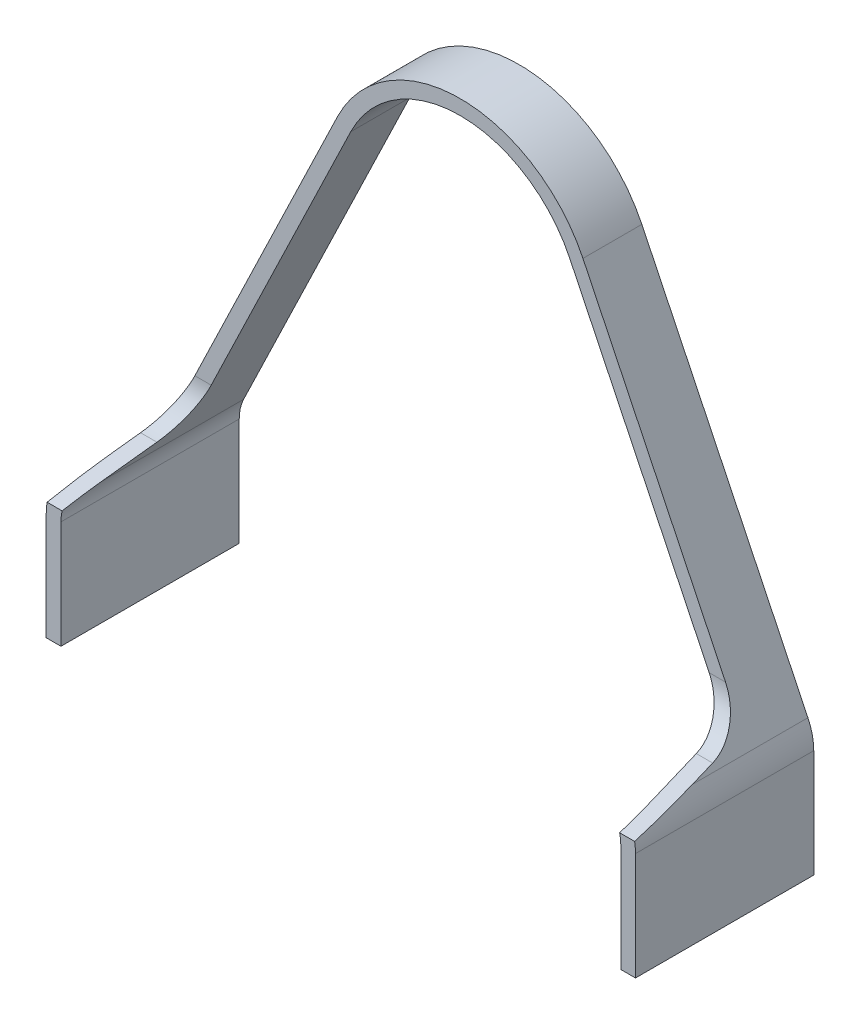
ISO-10303-21;
HEADER;
FILE_DESCRIPTION(('STEP AP214'),'2;1');
FILE_NAME('part.step','',(''),(''),'','','');
FILE_SCHEMA(('AUTOMOTIVE_DESIGN { 1 0 10303 214 1 1 1 1 }'));
ENDSEC;
DATA;
#1=APPLICATION_CONTEXT('core data for automotive mechanical design processes');
#2=APPLICATION_PROTOCOL_DEFINITION('international standard','automotive_design',2000,#1);
#3=PRODUCT_CONTEXT('',#1,'mechanical');
#4=PRODUCT('Part','Part','',(#3));
#5=PRODUCT_RELATED_PRODUCT_CATEGORY('part','',(#4));
#6=PRODUCT_DEFINITION_FORMATION('','',#4);
#7=PRODUCT_DEFINITION_CONTEXT('part definition',#1,'design');
#8=PRODUCT_DEFINITION('design','',#6,#7);
#9=PRODUCT_DEFINITION_SHAPE('','',#8);
#10=(LENGTH_UNIT() NAMED_UNIT(*) SI_UNIT(.MILLI.,.METRE.));
#11=(NAMED_UNIT(*) PLANE_ANGLE_UNIT() SI_UNIT($,.RADIAN.));
#12=(NAMED_UNIT(*) SI_UNIT($,.STERADIAN.) SOLID_ANGLE_UNIT());
#13=UNCERTAINTY_MEASURE_WITH_UNIT(LENGTH_MEASURE(1.E-05),#10,'distance_accuracy_value','');
#14=(GEOMETRIC_REPRESENTATION_CONTEXT(3) GLOBAL_UNCERTAINTY_ASSIGNED_CONTEXT((#13)) GLOBAL_UNIT_ASSIGNED_CONTEXT((#10,
#11,#12)) REPRESENTATION_CONTEXT('',''));
#15=CARTESIAN_POINT('',(0.,0.,0.));
#16=DIRECTION('',(0.,0.,1.));
#17=DIRECTION('',(1.,0.,0.));
#18=AXIS2_PLACEMENT_3D('',#15,#16,#17);
#19=CARTESIAN_POINT('',(160.,-210.857487735556,121.));
#20=DIRECTION('',(0.,0.,1.));
#21=DIRECTION('',(1.,0.,0.));
#22=AXIS2_PLACEMENT_3D('',#19,#20,#21);
#23=PLANE('',#22);
#24=DIRECTION('',(1.,0.,0.));
#25=VECTOR('',#24,1.);
#26=CARTESIAN_POINT('',(160.,-204.,121.));
#27=LINE('',#26,#25);
#28=CARTESIAN_POINT('',(-199.407802044223,-204.,121.));
#29=VERTEX_POINT('',#28);
#30=CARTESIAN_POINT('',(-189.205733374745,-204.,121.));
#31=VERTEX_POINT('',#30);
#32=EDGE_CURVE('E242',#29,#31,#27,.T.);
#33=ORIENTED_EDGE('',*,*,#32,.F.);
#34=CARTESIAN_POINT('',(-160.,-210.857487735556,121.));
#35=DIRECTION('',(0.,0.,1.));
#36=DIRECTION('',(-1.,0.,0.));
#37=AXIS2_PLACEMENT_3D('',#34,#35,#36);
#38=CIRCLE('',#37,40.);
#39=CARTESIAN_POINT('',(-200.,-210.857487735556,121.));
#40=VERTEX_POINT('',#39);
#41=EDGE_CURVE('E147',#29,#40,#38,.T.);
#42=ORIENTED_EDGE('',*,*,#41,.T.);
#43=DIRECTION('',(0.,-1.,0.));
#44=VECTOR('',#43,1.);
#45=CARTESIAN_POINT('',(-200.,-284.,121.));
#46=LINE('',#45,#44);
#47=CARTESIAN_POINT('',(-200.,-284.,121.));
#48=VERTEX_POINT('',#47);
#49=EDGE_CURVE('E140',#40,#48,#46,.T.);
#50=ORIENTED_EDGE('',*,*,#49,.T.);
#51=DIRECTION('',(1.,0.,0.));
#52=VECTOR('',#51,1.);
#53=CARTESIAN_POINT('',(-190.,-284.,121.));
#54=LINE('',#53,#52);
#55=CARTESIAN_POINT('',(-190.,-284.,121.));
#56=VERTEX_POINT('',#55);
#57=EDGE_CURVE('E144',#48,#56,#54,.T.);
#58=ORIENTED_EDGE('',*,*,#57,.T.);
#59=DIRECTION('',(0.,1.,0.));
#60=VECTOR('',#59,1.);
#61=CARTESIAN_POINT('',(-190.,-210.857487735556,121.));
#62=LINE('',#61,#60);
#63=CARTESIAN_POINT('',(-190.,-210.857487735556,121.));
#64=VERTEX_POINT('',#63);
#65=EDGE_CURVE('E59',#56,#64,#62,.T.);
#66=ORIENTED_EDGE('',*,*,#65,.T.);
#67=CARTESIAN_POINT('',(-160.,-210.857487735556,121.));
#68=DIRECTION('',(0.,0.,-1.));
#69=DIRECTION('',(-1.,0.,0.));
#70=AXIS2_PLACEMENT_3D('',#67,#68,#69);
#71=CIRCLE('',#70,30.);
#72=EDGE_CURVE('E165',#64,#31,#71,.T.);
#73=ORIENTED_EDGE('',*,*,#72,.T.);
#74=EDGE_LOOP('',(#33,#42,#50,#58,#66,#73));
#75=FACE_BOUND('',#74,.T.);
#76=ADVANCED_FACE('F35',(#75),#23,.T.);
#77=CARTESIAN_POINT('',(160.,-210.857487735556,121.));
#78=DIRECTION('',(0.,0.,-1.));
#79=DIRECTION('',(-1.,0.,0.));
#80=AXIS2_PLACEMENT_3D('',#77,#78,#79);
#81=CYLINDRICAL_SURFACE('',#80,30.);
#82=CARTESIAN_POINT('',(160.,-210.857487735556,121.));
#83=DIRECTION('',(0.,0.,-1.));
#84=DIRECTION('',(1.,0.,0.));
#85=AXIS2_PLACEMENT_3D('',#82,#83,#84);
#86=CIRCLE('',#85,30.);
#87=CARTESIAN_POINT('',(189.205733374745,-204.,121.));
#88=VERTEX_POINT('',#87);
#89=CARTESIAN_POINT('',(190.,-210.857487735556,121.));
#90=VERTEX_POINT('',#89);
#91=EDGE_CURVE('E124',#88,#90,#86,.T.);
#92=ORIENTED_EDGE('',*,*,#91,.F.);
#93=CARTESIAN_POINT('',(160.,-210.857487735556,148.772825329001));
#94=DIRECTION('',(0.,-0.970843443512661,-0.239714430496953));
#95=DIRECTION('',(0.,0.239714430496953,-0.970843443512661));
#96=AXIS2_PLACEMENT_3D('',#93,#94,#95);
#97=ELLIPSE('',#96,125.148911301697,30.);
#98=CARTESIAN_POINT('',(187.020661681244,-197.823538130476,95.9853294284267));
#99=VERTEX_POINT('',#98);
#100=EDGE_CURVE('E50',#88,#99,#97,.F.);
#101=ORIENTED_EDGE('',*,*,#100,.T.);
#102=DIRECTION('',(0.,0.,-1.));
#103=VECTOR('',#102,1.);
#104=CARTESIAN_POINT('',(187.020661681244,-197.823538130476,121.));
#105=LINE('',#104,#103);
#106=CARTESIAN_POINT('',(187.020661681244,-197.823538130476,0.));
#107=VERTEX_POINT('',#106);
#108=EDGE_CURVE('E116',#99,#107,#105,.T.);
#109=ORIENTED_EDGE('',*,*,#108,.T.);
#110=CARTESIAN_POINT('',(160.,-210.857487735556,0.));
#111=DIRECTION('',(0.,0.,-1.));
#112=DIRECTION('',(1.,0.,0.));
#113=AXIS2_PLACEMENT_3D('',#110,#111,#112);
#114=CIRCLE('',#113,30.);
#115=CARTESIAN_POINT('',(190.,-210.857487735556,0.));
#116=VERTEX_POINT('',#115);
#117=EDGE_CURVE('E170',#107,#116,#114,.T.);
#118=ORIENTED_EDGE('',*,*,#117,.T.);
#119=DIRECTION('',(0.,0.,-1.));
#120=VECTOR('',#119,1.);
#121=CARTESIAN_POINT('',(190.,-210.857487735556,121.));
#122=LINE('',#121,#120);
#123=EDGE_CURVE('E238',#90,#116,#122,.T.);
#124=ORIENTED_EDGE('',*,*,#123,.F.);
#125=EDGE_LOOP('',(#92,#101,#109,#118,#124));
#126=FACE_BOUND('',#125,.T.);
#127=ADVANCED_FACE('F37',(#126),#81,.F.);
#128=CARTESIAN_POINT('',(190.,-210.857487735556,121.));
#129=DIRECTION('',(1.,0.,0.));
#130=DIRECTION('',(0.,0.,-1.));
#131=AXIS2_PLACEMENT_3D('',#128,#129,#130);
#132=PLANE('',#131);
#133=DIRECTION('',(0.,-1.,0.));
#134=VECTOR('',#133,1.);
#135=CARTESIAN_POINT('',(190.,-210.857487735556,0.));
#136=LINE('',#135,#134);
#137=CARTESIAN_POINT('',(190.,-284.,0.));
#138=VERTEX_POINT('',#137);
#139=EDGE_CURVE('E172',#116,#138,#136,.T.);
#140=ORIENTED_EDGE('',*,*,#139,.T.);
#141=DIRECTION('',(0.,0.,-1.));
#142=VECTOR('',#141,1.);
#143=CARTESIAN_POINT('',(190.,-284.,121.));
#144=LINE('',#143,#142);
#145=CARTESIAN_POINT('',(190.,-284.,121.));
#146=VERTEX_POINT('',#145);
#147=EDGE_CURVE('E235',#146,#138,#144,.T.);
#148=ORIENTED_EDGE('',*,*,#147,.F.);
#149=DIRECTION('',(0.,-1.,0.));
#150=VECTOR('',#149,1.);
#151=CARTESIAN_POINT('',(190.,-210.857487735556,121.));
#152=LINE('',#151,#150);
#153=EDGE_CURVE('E308',#90,#146,#152,.T.);
#154=ORIENTED_EDGE('',*,*,#153,.F.);
#155=ORIENTED_EDGE('',*,*,#123,.T.);
#156=EDGE_LOOP('',(#140,#148,#154,#155));
#157=FACE_BOUND('',#156,.T.);
#158=ADVANCED_FACE('F376',(#157),#132,.F.);
#159=CARTESIAN_POINT('',(190.,-284.,121.));
#160=DIRECTION('',(0.,1.,0.));
#161=DIRECTION('',(-1.,0.,0.));
#162=AXIS2_PLACEMENT_3D('',#159,#160,#161);
#163=PLANE('',#162);
#164=DIRECTION('',(1.,0.,0.));
#165=VECTOR('',#164,1.);
#166=CARTESIAN_POINT('',(190.,-284.,0.));
#167=LINE('',#166,#165);
#168=CARTESIAN_POINT('',(200.,-284.,0.));
#169=VERTEX_POINT('',#168);
#170=EDGE_CURVE('E175',#138,#169,#167,.T.);
#171=ORIENTED_EDGE('',*,*,#170,.T.);
#172=DIRECTION('',(0.,0.,-1.));
#173=VECTOR('',#172,1.);
#174=CARTESIAN_POINT('',(200.,-284.,121.));
#175=LINE('',#174,#173);
#176=CARTESIAN_POINT('',(200.,-284.,121.));
#177=VERTEX_POINT('',#176);
#178=EDGE_CURVE('E232',#177,#169,#175,.T.);
#179=ORIENTED_EDGE('',*,*,#178,.F.);
#180=DIRECTION('',(1.,0.,0.));
#181=VECTOR('',#180,1.);
#182=CARTESIAN_POINT('',(190.,-284.,121.));
#183=LINE('',#182,#181);
#184=EDGE_CURVE('E310',#146,#177,#183,.T.);
#185=ORIENTED_EDGE('',*,*,#184,.F.);
#186=ORIENTED_EDGE('',*,*,#147,.T.);
#187=EDGE_LOOP('',(#171,#179,#185,#186));
#188=FACE_BOUND('',#187,.T.);
#189=ADVANCED_FACE('F381',(#188),#163,.F.);
#190=CARTESIAN_POINT('',(200.,-284.,121.));
#191=DIRECTION('',(-1.,0.,0.));
#192=DIRECTION('',(0.,0.,1.));
#193=AXIS2_PLACEMENT_3D('',#190,#191,#192);
#194=PLANE('',#193);
#195=DIRECTION('',(0.,1.,0.));
#196=VECTOR('',#195,1.);
#197=CARTESIAN_POINT('',(200.,-284.,0.));
#198=LINE('',#197,#196);
#199=CARTESIAN_POINT('',(200.,-210.857487735556,0.));
#200=VERTEX_POINT('',#199);
#201=EDGE_CURVE('E177',#169,#200,#198,.T.);
#202=ORIENTED_EDGE('',*,*,#201,.T.);
#203=DIRECTION('',(0.,0.,-1.));
#204=VECTOR('',#203,1.);
#205=CARTESIAN_POINT('',(200.,-210.857487735556,121.));
#206=LINE('',#205,#204);
#207=CARTESIAN_POINT('',(200.,-210.857487735556,121.));
#208=VERTEX_POINT('',#207);
#209=EDGE_CURVE('E229',#208,#200,#206,.T.);
#210=ORIENTED_EDGE('',*,*,#209,.F.);
#211=DIRECTION('',(0.,1.,0.));
#212=VECTOR('',#211,1.);
#213=CARTESIAN_POINT('',(200.,-284.,121.));
#214=LINE('',#213,#212);
#215=EDGE_CURVE('E312',#177,#208,#214,.T.);
#216=ORIENTED_EDGE('',*,*,#215,.F.);
#217=ORIENTED_EDGE('',*,*,#178,.T.);
#218=EDGE_LOOP('',(#202,#210,#216,#217));
#219=FACE_BOUND('',#218,.T.);
#220=ADVANCED_FACE('F384',(#219),#194,.F.);
#221=CARTESIAN_POINT('',(160.,-210.857487735556,121.));
#222=DIRECTION('',(0.,0.,-1.));
#223=DIRECTION('',(-1.,0.,0.));
#224=AXIS2_PLACEMENT_3D('',#221,#222,#223);
#225=CYLINDRICAL_SURFACE('',#224,40.);
#226=DIRECTION('',(0.,0.,-1.));
#227=VECTOR('',#226,1.);
#228=CARTESIAN_POINT('',(196.027548908325,-193.478888262116,121.));
#229=LINE('',#228,#227);
#230=CARTESIAN_POINT('',(196.027548908325,-193.478888262116,78.3894974615684));
#231=VERTEX_POINT('',#230);
#232=CARTESIAN_POINT('',(196.027548908325,-193.478888262116,0.));
#233=VERTEX_POINT('',#232);
#234=EDGE_CURVE('E227',#231,#233,#229,.T.);
#235=ORIENTED_EDGE('',*,*,#234,.F.);
#236=CARTESIAN_POINT('',(160.,-210.857487735556,148.772825329001));
#237=DIRECTION('',(0.,-0.970843443512661,-0.239714430496953));
#238=DIRECTION('',(0.,0.239714430496953,-0.970843443512661));
#239=AXIS2_PLACEMENT_3D('',#236,#237,#238);
#240=ELLIPSE('',#239,166.86521506893,40.);
#241=CARTESIAN_POINT('',(199.407802044224,-204.,121.));
#242=VERTEX_POINT('',#241);
#243=EDGE_CURVE('E281',#231,#242,#240,.T.);
#244=ORIENTED_EDGE('',*,*,#243,.T.);
#245=CARTESIAN_POINT('',(160.,-210.857487735556,121.));
#246=DIRECTION('',(0.,0.,1.));
#247=DIRECTION('',(1.,0.,0.));
#248=AXIS2_PLACEMENT_3D('',#245,#246,#247);
#249=CIRCLE('',#248,40.);
#250=EDGE_CURVE('E314',#208,#242,#249,.T.);
#251=ORIENTED_EDGE('',*,*,#250,.F.);
#252=ORIENTED_EDGE('',*,*,#209,.T.);
#253=CARTESIAN_POINT('',(160.,-210.857487735556,0.));
#254=DIRECTION('',(0.,0.,1.));
#255=DIRECTION('',(1.,0.,0.));
#256=AXIS2_PLACEMENT_3D('',#253,#254,#255);
#257=CIRCLE('',#256,40.);
#258=EDGE_CURVE('E179',#200,#233,#257,.T.);
#259=ORIENTED_EDGE('',*,*,#258,.T.);
#260=EDGE_LOOP('',(#235,#244,#251,#252,#259));
#261=FACE_BOUND('',#260,.T.);
#262=ADVANCED_FACE('F324',(#261),#225,.T.);
#263=CARTESIAN_POINT('',(83.3137068505016,40.18801128233,121.));
#264=DIRECTION('',(-0.900688722708126,-0.434464986836,0.));
#265=DIRECTION('',(0.434464986836,-0.900688722708126,0.));
#266=AXIS2_PLACEMENT_3D('',#263,#264,#265);
#267=PLANE('',#266);
#268=CARTESIAN_POINT('',(180.122638343312,-160.506441653902,70.));
#269=DIRECTION('',(-0.900688722708126,-0.434464986836,0.));
#270=DIRECTION('',(-0.434464986836,0.900688722708126,0.));
#271=AXIS2_PLACEMENT_3D('',#268,#269,#270);
#272=ELLIPSE('',#271,33.3078445900801,30.);
#273=CARTESIAN_POINT('',(180.122638343312,-160.506441653902,40.));
#274=VERTEX_POINT('',#273);
#275=CARTESIAN_POINT('',(194.171803385725,-189.631744959282,62.8085670850916));
#276=VERTEX_POINT('',#275);
#277=EDGE_CURVE('E173',#274,#276,#272,.T.);
#278=ORIENTED_EDGE('',*,*,#277,.T.);
#279=DIRECTION('',(0.114865630898278,-0.238127769812406,0.964417467740247));
#280=VECTOR('',#279,1.);
#281=CARTESIAN_POINT('',(192.869294116911,-186.931514917301,51.8726354150691));
#282=LINE('',#281,#280);
#283=EDGE_CURVE('E278',#276,#231,#282,.T.);
#284=ORIENTED_EDGE('',*,*,#283,.T.);
#285=ORIENTED_EDGE('',*,*,#234,.T.);
#286=DIRECTION('',(-0.434464986836,0.900688722708126,0.));
#287=VECTOR('',#286,1.);
#288=CARTESIAN_POINT('',(83.3137068505016,40.18801128233,0.));
#289=LINE('',#288,#287);
#290=CARTESIAN_POINT('',(83.3137068505016,40.18801128233,0.));
#291=VERTEX_POINT('',#290);
#292=EDGE_CURVE('E182',#233,#291,#289,.T.);
#293=ORIENTED_EDGE('',*,*,#292,.T.);
#294=DIRECTION('',(0.,0.,-1.));
#295=VECTOR('',#294,1.);
#296=CARTESIAN_POINT('',(83.3137068505016,40.18801128233,121.));
#297=LINE('',#296,#295);
#298=CARTESIAN_POINT('',(83.3137068505016,40.18801128233,40.));
#299=VERTEX_POINT('',#298);
#300=EDGE_CURVE('E225',#299,#291,#297,.T.);
#301=ORIENTED_EDGE('',*,*,#300,.F.);
#302=DIRECTION('',(0.434464986836,-0.900688722708126,0.));
#303=VECTOR('',#302,1.);
#304=CARTESIAN_POINT('',(83.3137068505016,40.18801128233,40.));
#305=LINE('',#304,#303);
#306=EDGE_CURVE('E296',#299,#274,#305,.T.);
#307=ORIENTED_EDGE('',*,*,#306,.T.);
#308=EDGE_LOOP('',(#278,#284,#285,#293,#301,#307));
#309=FACE_BOUND('',#308,.T.);
#310=ADVANCED_FACE('F337',(#309),#267,.F.);
#311=CARTESIAN_POINT('',(0.,0.,121.));
#312=DIRECTION('',(0.,0.,-1.));
#313=DIRECTION('',(-1.,0.,0.));
#314=AXIS2_PLACEMENT_3D('',#311,#312,#313);
#315=CYLINDRICAL_SURFACE('',#314,92.5);
#316=DIRECTION('',(0.,0.,-1.));
#317=VECTOR('',#316,1.);
#318=CARTESIAN_POINT('',(-83.3137068505016,40.1880112823299,121.));
#319=LINE('',#318,#317);
#320=CARTESIAN_POINT('',(-83.3137068505016,40.1880112823299,40.));
#321=VERTEX_POINT('',#320);
#322=CARTESIAN_POINT('',(-83.3137068505016,40.1880112823299,0.));
#323=VERTEX_POINT('',#322);
#324=EDGE_CURVE('E223',#321,#323,#319,.T.);
#325=ORIENTED_EDGE('',*,*,#324,.F.);
#326=CARTESIAN_POINT('',(0.,0.,40.));
#327=DIRECTION('',(0.,0.,-1.));
#328=DIRECTION('',(0.,1.,0.));
#329=AXIS2_PLACEMENT_3D('',#326,#327,#328);
#330=CIRCLE('',#329,92.5);
#331=EDGE_CURVE('E293',#321,#299,#330,.T.);
#332=ORIENTED_EDGE('',*,*,#331,.T.);
#333=ORIENTED_EDGE('',*,*,#300,.T.);
#334=CARTESIAN_POINT('',(0.,0.,0.));
#335=DIRECTION('',(0.,0.,1.));
#336=DIRECTION('',(1.,0.,0.));
#337=AXIS2_PLACEMENT_3D('',#334,#335,#336);
#338=CIRCLE('',#337,92.5);
#339=EDGE_CURVE('E185',#291,#323,#338,.T.);
#340=ORIENTED_EDGE('',*,*,#339,.T.);
#341=EDGE_LOOP('',(#325,#332,#333,#340));
#342=FACE_BOUND('',#341,.T.);
#343=ADVANCED_FACE('F391',(#342),#315,.T.);
#344=CARTESIAN_POINT('',(-83.3137068505016,40.1880112823299,121.));
#345=DIRECTION('',(0.900688722708126,-0.434464986835999,0.));
#346=DIRECTION('',(0.434464986835999,0.900688722708126,0.));
#347=AXIS2_PLACEMENT_3D('',#344,#345,#346);
#348=PLANE('',#347);
#349=DIRECTION('',(0.,0.,-1.));
#350=VECTOR('',#349,1.);
#351=CARTESIAN_POINT('',(-196.027548908325,-193.478888262116,121.));
#352=LINE('',#351,#350);
#353=CARTESIAN_POINT('',(-196.027548908325,-193.478888262116,78.3894974615686));
#354=VERTEX_POINT('',#353);
#355=CARTESIAN_POINT('',(-196.027548908325,-193.478888262116,0.));
#356=VERTEX_POINT('',#355);
#357=EDGE_CURVE('E221',#354,#356,#352,.T.);
#358=ORIENTED_EDGE('',*,*,#357,.F.);
#359=DIRECTION('',(0.114865630898278,0.238127769812406,-0.964417467740247));
#360=VECTOR('',#359,1.);
#361=CARTESIAN_POINT('',(-192.869294116911,-186.931514917301,51.8726354150691));
#362=LINE('',#361,#360);
#363=CARTESIAN_POINT('',(-194.171803385725,-189.631744959282,62.8085670850916));
#364=VERTEX_POINT('',#363);
#365=EDGE_CURVE('E271',#354,#364,#362,.T.);
#366=ORIENTED_EDGE('',*,*,#365,.T.);
#367=CARTESIAN_POINT('',(-180.122638343312,-160.506441653902,70.));
#368=DIRECTION('',(0.900688722708126,-0.434464986835999,0.));
#369=DIRECTION('',(-0.434464986835999,-0.900688722708126,0.));
#370=AXIS2_PLACEMENT_3D('',#367,#368,#369);
#371=ELLIPSE('',#370,33.3078445900801,30.);
#372=CARTESIAN_POINT('',(-180.122638343312,-160.506441653902,40.));
#373=VERTEX_POINT('',#372);
#374=EDGE_CURVE('E302',#364,#373,#371,.T.);
#375=ORIENTED_EDGE('',*,*,#374,.T.);
#376=DIRECTION('',(0.434464986835999,0.900688722708126,0.));
#377=VECTOR('',#376,1.);
#378=CARTESIAN_POINT('',(-83.3137068505016,40.1880112823299,40.));
#379=LINE('',#378,#377);
#380=EDGE_CURVE('E290',#373,#321,#379,.T.);
#381=ORIENTED_EDGE('',*,*,#380,.T.);
#382=ORIENTED_EDGE('',*,*,#324,.T.);
#383=DIRECTION('',(-0.434464986835999,-0.900688722708126,0.));
#384=VECTOR('',#383,1.);
#385=CARTESIAN_POINT('',(-83.3137068505016,40.1880112823299,0.));
#386=LINE('',#385,#384);
#387=EDGE_CURVE('E188',#323,#356,#386,.T.);
#388=ORIENTED_EDGE('',*,*,#387,.T.);
#389=EDGE_LOOP('',(#358,#366,#375,#381,#382,#388));
#390=FACE_BOUND('',#389,.T.);
#391=ADVANCED_FACE('F398',(#390),#348,.F.);
#392=CARTESIAN_POINT('',(-160.,-210.857487735556,121.));
#393=DIRECTION('',(0.,0.,-1.));
#394=DIRECTION('',(-1.,0.,0.));
#395=AXIS2_PLACEMENT_3D('',#392,#393,#394);
#396=CYLINDRICAL_SURFACE('',#395,40.);
#397=ORIENTED_EDGE('',*,*,#41,.F.);
#398=CARTESIAN_POINT('',(-160.,-210.857487735556,148.772825329001));
#399=DIRECTION('',(0.,-0.970843443512661,-0.239714430496953));
#400=DIRECTION('',(0.,0.239714430496953,-0.970843443512661));
#401=AXIS2_PLACEMENT_3D('',#398,#399,#400);
#402=ELLIPSE('',#401,166.86521506893,40.);
#403=EDGE_CURVE('E262',#29,#354,#402,.T.);
#404=ORIENTED_EDGE('',*,*,#403,.T.);
#405=ORIENTED_EDGE('',*,*,#357,.T.);
#406=CARTESIAN_POINT('',(-160.,-210.857487735556,0.));
#407=DIRECTION('',(0.,0.,1.));
#408=DIRECTION('',(-1.,0.,0.));
#409=AXIS2_PLACEMENT_3D('',#406,#407,#408);
#410=CIRCLE('',#409,40.);
#411=CARTESIAN_POINT('',(-200.,-210.857487735556,0.));
#412=VERTEX_POINT('',#411);
#413=EDGE_CURVE('E191',#356,#412,#410,.T.);
#414=ORIENTED_EDGE('',*,*,#413,.T.);
#415=DIRECTION('',(0.,0.,-1.));
#416=VECTOR('',#415,1.);
#417=CARTESIAN_POINT('',(-200.,-210.857487735556,121.));
#418=LINE('',#417,#416);
#419=EDGE_CURVE('E159',#40,#412,#418,.T.);
#420=ORIENTED_EDGE('',*,*,#419,.F.);
#421=EDGE_LOOP('',(#397,#404,#405,#414,#420));
#422=FACE_BOUND('',#421,.T.);
#423=ADVANCED_FACE('F563',(#422),#396,.T.);
#424=CARTESIAN_POINT('',(-200.,-284.,121.));
#425=DIRECTION('',(1.,0.,0.));
#426=DIRECTION('',(0.,0.,-1.));
#427=AXIS2_PLACEMENT_3D('',#424,#425,#426);
#428=PLANE('',#427);
#429=DIRECTION('',(0.,-1.,0.));
#430=VECTOR('',#429,1.);
#431=CARTESIAN_POINT('',(-200.,-284.,0.));
#432=LINE('',#431,#430);
#433=CARTESIAN_POINT('',(-200.,-284.,0.));
#434=VERTEX_POINT('',#433);
#435=EDGE_CURVE('E156',#412,#434,#432,.T.);
#436=ORIENTED_EDGE('',*,*,#435,.T.);
#437=DIRECTION('',(0.,0.,-1.));
#438=VECTOR('',#437,1.);
#439=CARTESIAN_POINT('',(-200.,-284.,121.));
#440=LINE('',#439,#438);
#441=EDGE_CURVE('E153',#48,#434,#440,.T.);
#442=ORIENTED_EDGE('',*,*,#441,.F.);
#443=ORIENTED_EDGE('',*,*,#49,.F.);
#444=ORIENTED_EDGE('',*,*,#419,.T.);
#445=EDGE_LOOP('',(#436,#442,#443,#444));
#446=FACE_BOUND('',#445,.T.);
#447=ADVANCED_FACE('F154',(#446),#428,.F.);
#448=CARTESIAN_POINT('',(-190.,-284.,121.));
#449=DIRECTION('',(0.,1.,0.));
#450=DIRECTION('',(-1.,0.,0.));
#451=AXIS2_PLACEMENT_3D('',#448,#449,#450);
#452=PLANE('',#451);
#453=DIRECTION('',(1.,0.,0.));
#454=VECTOR('',#453,1.);
#455=CARTESIAN_POINT('',(-190.,-284.,0.));
#456=LINE('',#455,#454);
#457=CARTESIAN_POINT('',(-190.,-284.,0.));
#458=VERTEX_POINT('',#457);
#459=EDGE_CURVE('E194',#434,#458,#456,.T.);
#460=ORIENTED_EDGE('',*,*,#459,.T.);
#461=DIRECTION('',(0.,0.,-1.));
#462=VECTOR('',#461,1.);
#463=CARTESIAN_POINT('',(-190.,-284.,121.));
#464=LINE('',#463,#462);
#465=EDGE_CURVE('E160',#56,#458,#464,.T.);
#466=ORIENTED_EDGE('',*,*,#465,.F.);
#467=ORIENTED_EDGE('',*,*,#57,.F.);
#468=ORIENTED_EDGE('',*,*,#441,.T.);
#469=EDGE_LOOP('',(#460,#466,#467,#468));
#470=FACE_BOUND('',#469,.T.);
#471=ADVANCED_FACE('F162',(#470),#452,.F.);
#472=CARTESIAN_POINT('',(-190.,-210.857487735556,121.));
#473=DIRECTION('',(-1.,0.,0.));
#474=DIRECTION('',(0.,0.,1.));
#475=AXIS2_PLACEMENT_3D('',#472,#473,#474);
#476=PLANE('',#475);
#477=DIRECTION('',(0.,1.,0.));
#478=VECTOR('',#477,1.);
#479=CARTESIAN_POINT('',(-190.,-210.857487735556,0.));
#480=LINE('',#479,#478);
#481=CARTESIAN_POINT('',(-190.,-210.857487735556,0.));
#482=VERTEX_POINT('',#481);
#483=EDGE_CURVE('E196',#458,#482,#480,.T.);
#484=ORIENTED_EDGE('',*,*,#483,.T.);
#485=DIRECTION('',(0.,0.,-1.));
#486=VECTOR('',#485,1.);
#487=CARTESIAN_POINT('',(-190.,-210.857487735556,121.));
#488=LINE('',#487,#486);
#489=EDGE_CURVE('E216',#64,#482,#488,.T.);
#490=ORIENTED_EDGE('',*,*,#489,.F.);
#491=ORIENTED_EDGE('',*,*,#65,.F.);
#492=ORIENTED_EDGE('',*,*,#465,.T.);
#493=EDGE_LOOP('',(#484,#490,#491,#492));
#494=FACE_BOUND('',#493,.T.);
#495=ADVANCED_FACE('F426',(#494),#476,.F.);
#496=CARTESIAN_POINT('',(-160.,-210.857487735556,121.));
#497=DIRECTION('',(0.,0.,-1.));
#498=DIRECTION('',(-1.,0.,0.));
#499=AXIS2_PLACEMENT_3D('',#496,#497,#498);
#500=CYLINDRICAL_SURFACE('',#499,30.);
#501=DIRECTION('',(0.,0.,-1.));
#502=VECTOR('',#501,1.);
#503=CARTESIAN_POINT('',(-187.020661681244,-197.823538130476,121.));
#504=LINE('',#503,#502);
#505=CARTESIAN_POINT('',(-187.020661681244,-197.823538130476,95.9853294284267));
#506=VERTEX_POINT('',#505);
#507=CARTESIAN_POINT('',(-187.020661681244,-197.823538130476,0.));
#508=VERTEX_POINT('',#507);
#509=EDGE_CURVE('E214',#506,#508,#504,.T.);
#510=ORIENTED_EDGE('',*,*,#509,.F.);
#511=CARTESIAN_POINT('',(-160.,-210.857487735556,148.772825329001));
#512=DIRECTION('',(0.,-0.970843443512661,-0.239714430496953));
#513=DIRECTION('',(0.,0.239714430496953,-0.970843443512661));
#514=AXIS2_PLACEMENT_3D('',#511,#512,#513);
#515=ELLIPSE('',#514,125.148911301697,30.);
#516=EDGE_CURVE('E257',#506,#31,#515,.F.);
#517=ORIENTED_EDGE('',*,*,#516,.T.);
#518=ORIENTED_EDGE('',*,*,#72,.F.);
#519=ORIENTED_EDGE('',*,*,#489,.T.);
#520=CARTESIAN_POINT('',(-160.,-210.857487735556,0.));
#521=DIRECTION('',(0.,0.,-1.));
#522=DIRECTION('',(-1.,0.,0.));
#523=AXIS2_PLACEMENT_3D('',#520,#521,#522);
#524=CIRCLE('',#523,30.);
#525=EDGE_CURVE('E198',#482,#508,#524,.T.);
#526=ORIENTED_EDGE('',*,*,#525,.T.);
#527=EDGE_LOOP('',(#510,#517,#518,#519,#526));
#528=FACE_BOUND('',#527,.T.);
#529=ADVANCED_FACE('F268',(#528),#500,.F.);
#530=CARTESIAN_POINT('',(-74.3068196234203,35.8433614139699,121.));
#531=DIRECTION('',(-0.900688722708126,0.434464986836,0.));
#532=DIRECTION('',(-0.434464986836,-0.900688722708126,0.));
#533=AXIS2_PLACEMENT_3D('',#530,#531,#532);
#534=PLANE('',#533);
#535=CARTESIAN_POINT('',(-169.020023479952,-160.506441653902,70.));
#536=DIRECTION('',(-0.900688722708126,0.434464986836,0.));
#537=DIRECTION('',(-0.434464986836,-0.900688722708126,0.));
#538=AXIS2_PLACEMENT_3D('',#535,#536,#537);
#539=ELLIPSE('',#538,33.3078445900801,30.);
#540=CARTESIAN_POINT('',(-169.020023479952,-160.506441653902,40.));
#541=VERTEX_POINT('',#540);
#542=CARTESIAN_POINT('',(-183.069188522365,-189.631744959282,62.8085670850916));
#543=VERTEX_POINT('',#542);
#544=EDGE_CURVE('E299',#541,#543,#539,.T.);
#545=ORIENTED_EDGE('',*,*,#544,.T.);
#546=DIRECTION('',(-0.114865630898278,-0.238127769812406,0.964417467740247));
#547=VECTOR('',#546,1.);
#548=CARTESIAN_POINT('',(-181.913168410449,-187.235201372169,53.1025655572854));
#549=LINE('',#548,#547);
#550=EDGE_CURVE('E269',#543,#506,#549,.T.);
#551=ORIENTED_EDGE('',*,*,#550,.T.);
#552=ORIENTED_EDGE('',*,*,#509,.T.);
#553=DIRECTION('',(0.434464986836,0.900688722708126,0.));
#554=VECTOR('',#553,1.);
#555=CARTESIAN_POINT('',(-74.3068196234203,35.8433614139699,0.));
#556=LINE('',#555,#554);
#557=CARTESIAN_POINT('',(-74.3068196234203,35.8433614139699,0.));
#558=VERTEX_POINT('',#557);
#559=EDGE_CURVE('E201',#508,#558,#556,.T.);
#560=ORIENTED_EDGE('',*,*,#559,.T.);
#561=DIRECTION('',(0.,0.,-1.));
#562=VECTOR('',#561,1.);
#563=CARTESIAN_POINT('',(-74.3068196234203,35.8433614139699,121.));
#564=LINE('',#563,#562);
#565=CARTESIAN_POINT('',(-74.3068196234203,35.8433614139699,40.));
#566=VERTEX_POINT('',#565);
#567=EDGE_CURVE('E212',#566,#558,#564,.T.);
#568=ORIENTED_EDGE('',*,*,#567,.F.);
#569=DIRECTION('',(-0.434464986836,-0.900688722708126,0.));
#570=VECTOR('',#569,1.);
#571=CARTESIAN_POINT('',(-74.3068196234203,35.8433614139699,40.));
#572=LINE('',#571,#570);
#573=EDGE_CURVE('E287',#566,#541,#572,.T.);
#574=ORIENTED_EDGE('',*,*,#573,.T.);
#575=EDGE_LOOP('',(#545,#551,#552,#560,#568,#574));
#576=FACE_BOUND('',#575,.T.);
#577=ADVANCED_FACE('F410',(#576),#534,.F.);
#578=CARTESIAN_POINT('',(0.,0.,121.));
#579=DIRECTION('',(0.,0.,-1.));
#580=DIRECTION('',(-1.,0.,0.));
#581=AXIS2_PLACEMENT_3D('',#578,#579,#580);
#582=CYLINDRICAL_SURFACE('',#581,82.5);
#583=DIRECTION('',(0.,0.,-1.));
#584=VECTOR('',#583,1.);
#585=CARTESIAN_POINT('',(74.3068196234203,35.84336141397,121.));
#586=LINE('',#585,#584);
#587=CARTESIAN_POINT('',(74.3068196234203,35.84336141397,40.));
#588=VERTEX_POINT('',#587);
#589=CARTESIAN_POINT('',(74.3068196234203,35.84336141397,0.));
#590=VERTEX_POINT('',#589);
#591=EDGE_CURVE('E210',#588,#590,#586,.T.);
#592=ORIENTED_EDGE('',*,*,#591,.F.);
#593=CARTESIAN_POINT('',(0.,0.,40.));
#594=DIRECTION('',(0.,0.,-1.));
#595=DIRECTION('',(0.,1.,0.));
#596=AXIS2_PLACEMENT_3D('',#593,#594,#595);
#597=CIRCLE('',#596,82.5);
#598=EDGE_CURVE('E284',#588,#566,#597,.F.);
#599=ORIENTED_EDGE('',*,*,#598,.T.);
#600=ORIENTED_EDGE('',*,*,#567,.T.);
#601=CARTESIAN_POINT('',(0.,0.,0.));
#602=DIRECTION('',(0.,0.,-1.));
#603=DIRECTION('',(1.,0.,0.));
#604=AXIS2_PLACEMENT_3D('',#601,#602,#603);
#605=CIRCLE('',#604,82.5);
#606=EDGE_CURVE('E204',#558,#590,#605,.T.);
#607=ORIENTED_EDGE('',*,*,#606,.T.);
#608=EDGE_LOOP('',(#592,#599,#600,#607));
#609=FACE_BOUND('',#608,.T.);
#610=ADVANCED_FACE('F421',(#609),#582,.F.);
#611=CARTESIAN_POINT('',(74.3068196234203,35.84336141397,121.));
#612=DIRECTION('',(0.900688722708126,0.434464986836,0.));
#613=DIRECTION('',(-0.434464986836,0.900688722708126,0.));
#614=AXIS2_PLACEMENT_3D('',#611,#612,#613);
#615=PLANE('',#614);
#616=ORIENTED_EDGE('',*,*,#108,.F.);
#617=DIRECTION('',(-0.114865630898278,0.238127769812406,-0.964417467740247));
#618=VECTOR('',#617,1.);
#619=CARTESIAN_POINT('',(181.913168410449,-187.235201372169,53.1025655572854));
#620=LINE('',#619,#618);
#621=CARTESIAN_POINT('',(183.069188522365,-189.631744959282,62.8085670850916));
#622=VERTEX_POINT('',#621);
#623=EDGE_CURVE('E363',#99,#622,#620,.T.);
#624=ORIENTED_EDGE('',*,*,#623,.T.);
#625=CARTESIAN_POINT('',(169.020023479952,-160.506441653902,70.));
#626=DIRECTION('',(0.900688722708126,0.434464986836,0.));
#627=DIRECTION('',(-0.434464986836,0.900688722708126,0.));
#628=AXIS2_PLACEMENT_3D('',#625,#626,#627);
#629=ELLIPSE('',#628,33.3078445900801,30.);
#630=CARTESIAN_POINT('',(169.020023479952,-160.506441653902,40.));
#631=VERTEX_POINT('',#630);
#632=EDGE_CURVE('E11',#622,#631,#629,.T.);
#633=ORIENTED_EDGE('',*,*,#632,.T.);
#634=DIRECTION('',(-0.434464986836,0.900688722708126,0.));
#635=VECTOR('',#634,1.);
#636=CARTESIAN_POINT('',(74.3068196234203,35.84336141397,40.));
#637=LINE('',#636,#635);
#638=EDGE_CURVE('E43',#631,#588,#637,.T.);
#639=ORIENTED_EDGE('',*,*,#638,.T.);
#640=ORIENTED_EDGE('',*,*,#591,.T.);
#641=DIRECTION('',(0.434464986836,-0.900688722708125,0.));
#642=VECTOR('',#641,1.);
#643=CARTESIAN_POINT('',(74.3068196234203,35.84336141397,0.));
#644=LINE('',#643,#642);
#645=EDGE_CURVE('E207',#590,#107,#644,.T.);
#646=ORIENTED_EDGE('',*,*,#645,.T.);
#647=EDGE_LOOP('',(#616,#624,#633,#639,#640,#646));
#648=FACE_BOUND('',#647,.T.);
#649=ADVANCED_FACE('F368',(#648),#615,.F.);
#650=EDGE_CURVE('E241',#88,#242,#27,.T.);
#651=ORIENTED_EDGE('',*,*,#650,.F.);
#652=ORIENTED_EDGE('',*,*,#91,.T.);
#653=ORIENTED_EDGE('',*,*,#153,.T.);
#654=ORIENTED_EDGE('',*,*,#184,.T.);
#655=ORIENTED_EDGE('',*,*,#215,.T.);
#656=ORIENTED_EDGE('',*,*,#250,.T.);
#657=EDGE_LOOP('',(#651,#652,#653,#654,#655,#656));
#658=FACE_BOUND('',#657,.T.);
#659=ADVANCED_FACE('F317',(#658),#23,.T.);
#660=CARTESIAN_POINT('',(160.,-210.857487735556,0.));
#661=DIRECTION('',(0.,0.,1.));
#662=DIRECTION('',(1.,0.,0.));
#663=AXIS2_PLACEMENT_3D('',#660,#661,#662);
#664=PLANE('',#663);
#665=ORIENTED_EDGE('',*,*,#117,.F.);
#666=ORIENTED_EDGE('',*,*,#645,.F.);
#667=ORIENTED_EDGE('',*,*,#606,.F.);
#668=ORIENTED_EDGE('',*,*,#559,.F.);
#669=ORIENTED_EDGE('',*,*,#525,.F.);
#670=ORIENTED_EDGE('',*,*,#483,.F.);
#671=ORIENTED_EDGE('',*,*,#459,.F.);
#672=ORIENTED_EDGE('',*,*,#435,.F.);
#673=ORIENTED_EDGE('',*,*,#413,.F.);
#674=ORIENTED_EDGE('',*,*,#387,.F.);
#675=ORIENTED_EDGE('',*,*,#339,.F.);
#676=ORIENTED_EDGE('',*,*,#292,.F.);
#677=ORIENTED_EDGE('',*,*,#258,.F.);
#678=ORIENTED_EDGE('',*,*,#201,.F.);
#679=ORIENTED_EDGE('',*,*,#170,.F.);
#680=ORIENTED_EDGE('',*,*,#139,.F.);
#681=EDGE_LOOP('',(#665,#666,#667,#668,#669,#670,#671,#672,#673,#674,#675,#676,#677,#678,#679,#680));
#682=FACE_BOUND('',#681,.T.);
#683=ADVANCED_FACE('F373',(#682),#664,.F.);
#684=CARTESIAN_POINT('',(200.,-160.506441653902,70.));
#685=DIRECTION('',(-1.,0.,0.));
#686=DIRECTION('',(0.,0.,1.));
#687=AXIS2_PLACEMENT_3D('',#684,#685,#686);
#688=CYLINDRICAL_SURFACE('',#687,30.);
#689=DIRECTION('',(-1.,0.,0.));
#690=VECTOR('',#689,1.);
#691=CARTESIAN_POINT('',(200.,-160.506441653902,40.));
#692=LINE('',#691,#690);
#693=EDGE_CURVE('E349',#274,#631,#692,.T.);
#694=ORIENTED_EDGE('',*,*,#693,.T.);
#695=ORIENTED_EDGE('',*,*,#632,.F.);
#696=DIRECTION('',(-1.,0.,0.));
#697=VECTOR('',#696,1.);
#698=CARTESIAN_POINT('',(200.,-189.631744959282,62.8085670850916));
#699=LINE('',#698,#697);
#700=EDGE_CURVE('E350',#276,#622,#699,.T.);
#701=ORIENTED_EDGE('',*,*,#700,.F.);
#702=ORIENTED_EDGE('',*,*,#277,.F.);
#703=EDGE_LOOP('',(#694,#695,#701,#702));
#704=FACE_BOUND('',#703,.T.);
#705=ADVANCED_FACE('F346',(#704),#688,.F.);
#706=EDGE_CURVE('E356',#543,#364,#699,.T.);
#707=ORIENTED_EDGE('',*,*,#706,.F.);
#708=ORIENTED_EDGE('',*,*,#544,.F.);
#709=EDGE_CURVE('E357',#541,#373,#692,.T.);
#710=ORIENTED_EDGE('',*,*,#709,.T.);
#711=ORIENTED_EDGE('',*,*,#374,.F.);
#712=EDGE_LOOP('',(#707,#708,#710,#711));
#713=FACE_BOUND('',#712,.T.);
#714=ADVANCED_FACE('F404',(#713),#688,.F.);
#715=CARTESIAN_POINT('',(200.,92.5,40.));
#716=DIRECTION('',(0.,0.,-1.));
#717=DIRECTION('',(0.,1.,0.));
#718=AXIS2_PLACEMENT_3D('',#715,#716,#717);
#719=PLANE('',#718);
#720=ORIENTED_EDGE('',*,*,#331,.F.);
#721=ORIENTED_EDGE('',*,*,#380,.F.);
#722=ORIENTED_EDGE('',*,*,#709,.F.);
#723=ORIENTED_EDGE('',*,*,#573,.F.);
#724=ORIENTED_EDGE('',*,*,#598,.F.);
#725=ORIENTED_EDGE('',*,*,#638,.F.);
#726=ORIENTED_EDGE('',*,*,#693,.F.);
#727=ORIENTED_EDGE('',*,*,#306,.F.);
#728=EDGE_LOOP('',(#720,#721,#722,#723,#724,#725,#726,#727));
#729=FACE_BOUND('',#728,.T.);
#730=ADVANCED_FACE('F354',(#729),#719,.F.);
#731=CARTESIAN_POINT('',(200.,-189.631744959282,62.8085670850916));
#732=DIRECTION('',(0.,-0.970843443512661,-0.239714430496953));
#733=DIRECTION('',(0.,0.239714430496953,-0.970843443512661));
#734=AXIS2_PLACEMENT_3D('',#731,#732,#733);
#735=PLANE('',#734);
#736=ORIENTED_EDGE('',*,*,#283,.F.);
#737=ORIENTED_EDGE('',*,*,#700,.T.);
#738=ORIENTED_EDGE('',*,*,#623,.F.);
#739=ORIENTED_EDGE('',*,*,#100,.F.);
#740=ORIENTED_EDGE('',*,*,#650,.T.);
#741=ORIENTED_EDGE('',*,*,#243,.F.);
#742=EDGE_LOOP('',(#736,#737,#738,#739,#740,#741));
#743=FACE_BOUND('',#742,.T.);
#744=ADVANCED_FACE('F329',(#743),#735,.F.);
#745=ORIENTED_EDGE('',*,*,#403,.F.);
#746=ORIENTED_EDGE('',*,*,#32,.T.);
#747=ORIENTED_EDGE('',*,*,#516,.F.);
#748=ORIENTED_EDGE('',*,*,#550,.F.);
#749=ORIENTED_EDGE('',*,*,#706,.T.);
#750=ORIENTED_EDGE('',*,*,#365,.F.);
#751=EDGE_LOOP('',(#745,#746,#747,#748,#749,#750));
#752=FACE_BOUND('',#751,.T.);
#753=ADVANCED_FACE('F254',(#752),#735,.F.);
#754=CLOSED_SHELL('',(#76,#127,#158,#189,#220,#262,#310,#343,#391,#423,#447,#471,#495,#529,#577,
#610,#649,#659,#683,#705,#714,#730,#744,#753));
#755=MANIFOLD_SOLID_BREP('B2',#754);
#756=ADVANCED_BREP_SHAPE_REPRESENTATION('',(#18,#755),#14);
#757=SHAPE_DEFINITION_REPRESENTATION(#9,#756);
ENDSEC;
END-ISO-10303-21;
